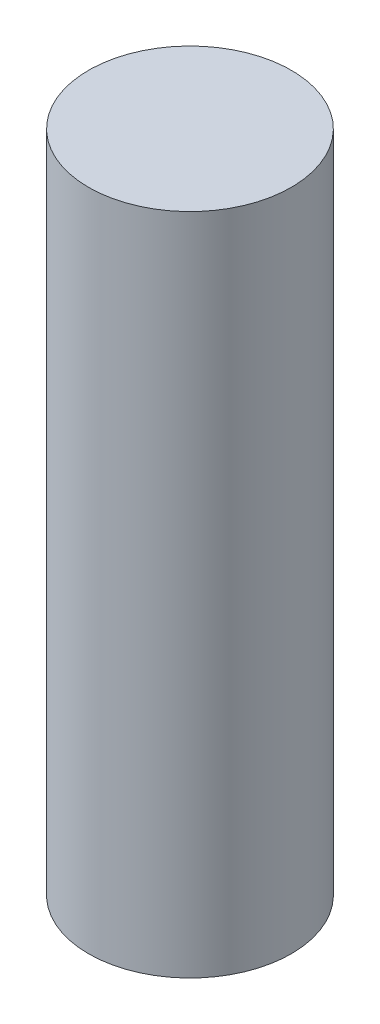
ISO-10303-21;
HEADER;
FILE_DESCRIPTION(('STEP AP214'),'2;1');
FILE_NAME('part.step','',(''),(''),'','','');
FILE_SCHEMA(('AUTOMOTIVE_DESIGN { 1 0 10303 214 1 1 1 1 }'));
ENDSEC;
DATA;
#1=APPLICATION_CONTEXT('core data for automotive mechanical design processes');
#2=APPLICATION_PROTOCOL_DEFINITION('international standard','automotive_design',2000,#1);
#3=PRODUCT_CONTEXT('',#1,'mechanical');
#4=PRODUCT('Part','Part','',(#3));
#5=PRODUCT_RELATED_PRODUCT_CATEGORY('part','',(#4));
#6=PRODUCT_DEFINITION_FORMATION('','',#4);
#7=PRODUCT_DEFINITION_CONTEXT('part definition',#1,'design');
#8=PRODUCT_DEFINITION('design','',#6,#7);
#9=PRODUCT_DEFINITION_SHAPE('','',#8);
#10=(LENGTH_UNIT() NAMED_UNIT(*) SI_UNIT(.MILLI.,.METRE.));
#11=(NAMED_UNIT(*) PLANE_ANGLE_UNIT() SI_UNIT($,.RADIAN.));
#12=(NAMED_UNIT(*) SI_UNIT($,.STERADIAN.) SOLID_ANGLE_UNIT());
#13=UNCERTAINTY_MEASURE_WITH_UNIT(LENGTH_MEASURE(1.E-05),#10,'distance_accuracy_value','');
#14=(GEOMETRIC_REPRESENTATION_CONTEXT(3) GLOBAL_UNCERTAINTY_ASSIGNED_CONTEXT((#13)) GLOBAL_UNIT_ASSIGNED_CONTEXT((#10,
#11,#12)) REPRESENTATION_CONTEXT('',''));
#15=CARTESIAN_POINT('',(0.,0.,0.));
#16=DIRECTION('',(0.,0.,1.));
#17=DIRECTION('',(1.,0.,0.));
#18=AXIS2_PLACEMENT_3D('',#15,#16,#17);
#19=CARTESIAN_POINT('',(0.,108.,0.));
#20=DIRECTION('',(0.,-1.,0.));
#21=DIRECTION('',(0.,0.,-1.));
#22=AXIS2_PLACEMENT_3D('',#19,#20,#21);
#23=CYLINDRICAL_SURFACE('',#22,16.5);
#24=CARTESIAN_POINT('',(0.,108.,0.));
#25=DIRECTION('',(0.,1.,0.));
#26=DIRECTION('',(0.,0.,1.));
#27=AXIS2_PLACEMENT_3D('',#24,#25,#26);
#28=CIRCLE('',#27,16.5);
#29=CARTESIAN_POINT('',(0.,108.,16.5));
#30=VERTEX_POINT('',#29);
#31=EDGE_CURVE('E10',#30,#30,#28,.T.);
#32=ORIENTED_EDGE('',*,*,#31,.F.);
#33=EDGE_LOOP('',(#32));
#34=FACE_BOUND('',#33,.T.);
#35=CARTESIAN_POINT('',(0.,0.,0.));
#36=DIRECTION('',(0.,1.,0.));
#37=DIRECTION('',(0.,0.,1.));
#38=AXIS2_PLACEMENT_3D('',#35,#36,#37);
#39=CIRCLE('',#38,16.5);
#40=CARTESIAN_POINT('',(0.,0.,16.5));
#41=VERTEX_POINT('',#40);
#42=EDGE_CURVE('E40',#41,#41,#39,.T.);
#43=ORIENTED_EDGE('',*,*,#42,.T.);
#44=EDGE_LOOP('',(#43));
#45=FACE_BOUND('',#44,.T.);
#46=ADVANCED_FACE('F37',(#34,#45),#23,.T.);
#47=CARTESIAN_POINT('',(0.,108.,0.));
#48=DIRECTION('',(0.,1.,0.));
#49=DIRECTION('',(0.,0.,1.));
#50=AXIS2_PLACEMENT_3D('',#47,#48,#49);
#51=PLANE('',#50);
#52=ORIENTED_EDGE('',*,*,#31,.T.);
#53=EDGE_LOOP('',(#52));
#54=FACE_BOUND('',#53,.T.);
#55=ADVANCED_FACE('F52',(#54),#51,.T.);
#56=CARTESIAN_POINT('',(0.,0.,0.));
#57=DIRECTION('',(0.,1.,0.));
#58=DIRECTION('',(0.,0.,1.));
#59=AXIS2_PLACEMENT_3D('',#56,#57,#58);
#60=PLANE('',#59);
#61=ORIENTED_EDGE('',*,*,#42,.F.);
#62=EDGE_LOOP('',(#61));
#63=FACE_BOUND('',#62,.T.);
#64=ADVANCED_FACE('F50',(#63),#60,.F.);
#65=CLOSED_SHELL('',(#46,#55,#64));
#66=MANIFOLD_SOLID_BREP('B2',#65);
#67=ADVANCED_BREP_SHAPE_REPRESENTATION('',(#18,#66),#14);
#68=SHAPE_DEFINITION_REPRESENTATION(#9,#67);
ENDSEC;
END-ISO-10303-21;
